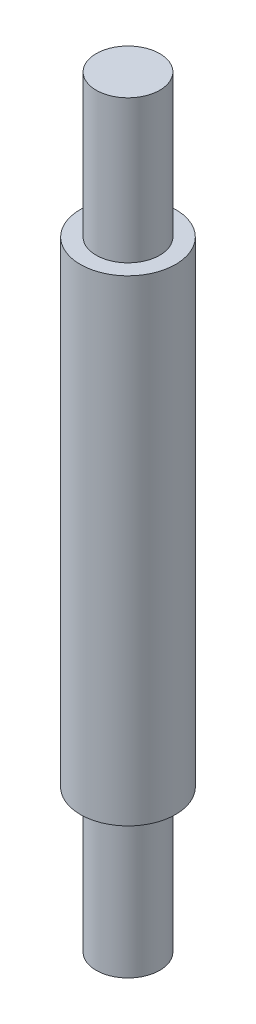
ISO-10303-21;
HEADER;
FILE_DESCRIPTION(('STEP AP214'),'2;1');
FILE_NAME('part.step','',(''),(''),'','','');
FILE_SCHEMA(('AUTOMOTIVE_DESIGN { 1 0 10303 214 1 1 1 1 }'));
ENDSEC;
DATA;
#1=APPLICATION_CONTEXT('core data for automotive mechanical design processes');
#2=APPLICATION_PROTOCOL_DEFINITION('international standard','automotive_design',2000,#1);
#3=PRODUCT_CONTEXT('',#1,'mechanical');
#4=PRODUCT('Part','Part','',(#3));
#5=PRODUCT_RELATED_PRODUCT_CATEGORY('part','',(#4));
#6=PRODUCT_DEFINITION_FORMATION('','',#4);
#7=PRODUCT_DEFINITION_CONTEXT('part definition',#1,'design');
#8=PRODUCT_DEFINITION('design','',#6,#7);
#9=PRODUCT_DEFINITION_SHAPE('','',#8);
#10=(LENGTH_UNIT() NAMED_UNIT(*) SI_UNIT(.MILLI.,.METRE.));
#11=(NAMED_UNIT(*) PLANE_ANGLE_UNIT() SI_UNIT($,.RADIAN.));
#12=(NAMED_UNIT(*) SI_UNIT($,.STERADIAN.) SOLID_ANGLE_UNIT());
#13=UNCERTAINTY_MEASURE_WITH_UNIT(LENGTH_MEASURE(1.E-05),#10,'distance_accuracy_value','');
#14=(GEOMETRIC_REPRESENTATION_CONTEXT(3) GLOBAL_UNCERTAINTY_ASSIGNED_CONTEXT((#13)) GLOBAL_UNIT_ASSIGNED_CONTEXT((#10,
#11,#12)) REPRESENTATION_CONTEXT('',''));
#15=CARTESIAN_POINT('',(0.,0.,0.));
#16=DIRECTION('',(0.,0.,1.));
#17=DIRECTION('',(1.,0.,0.));
#18=AXIS2_PLACEMENT_3D('',#15,#16,#17);
#19=CARTESIAN_POINT('',(0.,75.,0.));
#20=DIRECTION('',(0.,-1.,0.));
#21=DIRECTION('',(0.,0.,-1.));
#22=AXIS2_PLACEMENT_3D('',#19,#20,#21);
#23=CYLINDRICAL_SURFACE('',#22,15.);
#24=CARTESIAN_POINT('',(0.,75.,0.));
#25=DIRECTION('',(0.,1.,0.));
#26=DIRECTION('',(0.,0.,1.));
#27=AXIS2_PLACEMENT_3D('',#24,#25,#26);
#28=CIRCLE('',#27,15.);
#29=CARTESIAN_POINT('',(0.,75.,15.));
#30=VERTEX_POINT('',#29);
#31=EDGE_CURVE('E44',#30,#30,#28,.T.);
#32=ORIENTED_EDGE('',*,*,#31,.F.);
#33=EDGE_LOOP('',(#32));
#34=FACE_BOUND('',#33,.T.);
#35=CARTESIAN_POINT('',(0.,-75.,0.));
#36=DIRECTION('',(0.,1.,0.));
#37=DIRECTION('',(0.,0.,1.));
#38=AXIS2_PLACEMENT_3D('',#35,#36,#37);
#39=CIRCLE('',#38,15.);
#40=CARTESIAN_POINT('',(0.,-75.,15.));
#41=VERTEX_POINT('',#40);
#42=EDGE_CURVE('E40',#41,#41,#39,.T.);
#43=ORIENTED_EDGE('',*,*,#42,.T.);
#44=EDGE_LOOP('',(#43));
#45=FACE_BOUND('',#44,.T.);
#46=ADVANCED_FACE('F37',(#34,#45),#23,.T.);
#47=CARTESIAN_POINT('',(0.,75.,0.));
#48=DIRECTION('',(0.,1.,0.));
#49=DIRECTION('',(0.,0.,1.));
#50=AXIS2_PLACEMENT_3D('',#47,#48,#49);
#51=PLANE('',#50);
#52=CARTESIAN_POINT('',(0.,75.,0.));
#53=DIRECTION('',(0.,1.,0.));
#54=DIRECTION('',(0.,0.,1.));
#55=AXIS2_PLACEMENT_3D('',#52,#53,#54);
#56=CIRCLE('',#55,10.);
#57=CARTESIAN_POINT('',(0.,75.,-10.));
#58=VERTEX_POINT('',#57);
#59=EDGE_CURVE('E10',#58,#58,#56,.T.);
#60=ORIENTED_EDGE('',*,*,#59,.F.);
#61=EDGE_LOOP('',(#60));
#62=FACE_BOUND('',#61,.T.);
#63=ORIENTED_EDGE('',*,*,#31,.T.);
#64=EDGE_LOOP('',(#63));
#65=FACE_BOUND('',#64,.T.);
#66=ADVANCED_FACE('F72',(#62,#65),#51,.T.);
#67=CARTESIAN_POINT('',(0.,-75.,0.));
#68=DIRECTION('',(0.,1.,0.));
#69=DIRECTION('',(0.,0.,1.));
#70=AXIS2_PLACEMENT_3D('',#67,#68,#69);
#71=PLANE('',#70);
#72=CARTESIAN_POINT('',(0.,-75.,0.));
#73=DIRECTION('',(0.,1.,0.));
#74=DIRECTION('',(0.,0.,1.));
#75=AXIS2_PLACEMENT_3D('',#72,#73,#74);
#76=CIRCLE('',#75,10.);
#77=CARTESIAN_POINT('',(0.,-75.,10.));
#78=VERTEX_POINT('',#77);
#79=EDGE_CURVE('E54',#78,#78,#76,.T.);
#80=ORIENTED_EDGE('',*,*,#79,.T.);
#81=EDGE_LOOP('',(#80));
#82=FACE_BOUND('',#81,.T.);
#83=ORIENTED_EDGE('',*,*,#42,.F.);
#84=EDGE_LOOP('',(#83));
#85=FACE_BOUND('',#84,.T.);
#86=ADVANCED_FACE('F77',(#82,#85),#71,.F.);
#87=CARTESIAN_POINT('',(0.,120.,0.));
#88=DIRECTION('',(0.,-1.,0.));
#89=DIRECTION('',(0.,0.,-1.));
#90=AXIS2_PLACEMENT_3D('',#87,#88,#89);
#91=CYLINDRICAL_SURFACE('',#90,10.);
#92=CARTESIAN_POINT('',(0.,120.,0.));
#93=DIRECTION('',(0.,1.,0.));
#94=DIRECTION('',(0.,0.,1.));
#95=AXIS2_PLACEMENT_3D('',#92,#93,#94);
#96=CIRCLE('',#95,10.);
#97=CARTESIAN_POINT('',(0.,120.,-10.));
#98=VERTEX_POINT('',#97);
#99=EDGE_CURVE('E50',#98,#98,#96,.T.);
#100=CARTESIAN_POINT('',(0.,120.,-10.));
#101=CARTESIAN_POINT('',(0.,119.53125,-10.));
#102=CARTESIAN_POINT('',(0.,119.0625,-10.));
#103=CARTESIAN_POINT('',(0.,118.125,-10.));
#104=CARTESIAN_POINT('',(0.,117.65625,-10.));
#105=CARTESIAN_POINT('',(0.,116.71875,-10.));
#106=CARTESIAN_POINT('',(0.,116.25,-10.));
#107=CARTESIAN_POINT('',(0.,115.3125,-10.));
#108=CARTESIAN_POINT('',(0.,114.84375,-10.));
#109=CARTESIAN_POINT('',(0.,113.90625,-10.));
#110=CARTESIAN_POINT('',(0.,113.4375,-10.));
#111=CARTESIAN_POINT('',(0.,112.5,-10.));
#112=CARTESIAN_POINT('',(0.,112.03125,-10.));
#113=CARTESIAN_POINT('',(0.,111.09375,-10.));
#114=CARTESIAN_POINT('',(0.,110.625,-10.));
#115=CARTESIAN_POINT('',(0.,109.6875,-10.));
#116=CARTESIAN_POINT('',(0.,109.21875,-10.));
#117=CARTESIAN_POINT('',(0.,108.28125,-10.));
#118=CARTESIAN_POINT('',(0.,107.8125,-10.));
#119=CARTESIAN_POINT('',(0.,106.875,-10.));
#120=CARTESIAN_POINT('',(0.,106.40625,-10.));
#121=CARTESIAN_POINT('',(0.,105.46875,-10.));
#122=CARTESIAN_POINT('',(0.,105.,-10.));
#123=CARTESIAN_POINT('',(0.,104.0625,-10.));
#124=CARTESIAN_POINT('',(0.,103.59375,-10.));
#125=CARTESIAN_POINT('',(0.,102.65625,-10.));
#126=CARTESIAN_POINT('',(0.,102.1875,-10.));
#127=CARTESIAN_POINT('',(0.,101.25,-10.));
#128=CARTESIAN_POINT('',(0.,100.78125,-10.));
#129=CARTESIAN_POINT('',(0.,99.84375,-10.));
#130=CARTESIAN_POINT('',(0.,99.375,-10.));
#131=CARTESIAN_POINT('',(0.,98.4375,-10.));
#132=CARTESIAN_POINT('',(0.,97.96875,-10.));
#133=CARTESIAN_POINT('',(0.,97.03125,-10.));
#134=CARTESIAN_POINT('',(0.,96.5625,-10.));
#135=CARTESIAN_POINT('',(0.,95.625,-10.));
#136=CARTESIAN_POINT('',(0.,95.15625,-10.));
#137=CARTESIAN_POINT('',(0.,94.21875,-10.));
#138=CARTESIAN_POINT('',(0.,93.75,-10.));
#139=CARTESIAN_POINT('',(0.,92.8125,-10.));
#140=CARTESIAN_POINT('',(0.,92.34375,-10.));
#141=CARTESIAN_POINT('',(0.,91.40625,-10.));
#142=CARTESIAN_POINT('',(0.,90.9375,-10.));
#143=CARTESIAN_POINT('',(0.,90.,-10.));
#144=CARTESIAN_POINT('',(0.,89.53125,-10.));
#145=CARTESIAN_POINT('',(0.,88.59375,-10.));
#146=CARTESIAN_POINT('',(0.,88.125,-10.));
#147=CARTESIAN_POINT('',(0.,87.1875,-10.));
#148=CARTESIAN_POINT('',(0.,86.71875,-10.));
#149=CARTESIAN_POINT('',(0.,85.78125,-10.));
#150=CARTESIAN_POINT('',(0.,85.3125,-10.));
#151=CARTESIAN_POINT('',(0.,84.375,-10.));
#152=CARTESIAN_POINT('',(0.,83.90625,-10.));
#153=CARTESIAN_POINT('',(0.,82.96875,-10.));
#154=CARTESIAN_POINT('',(0.,82.5,-10.));
#155=CARTESIAN_POINT('',(0.,81.5625,-10.));
#156=CARTESIAN_POINT('',(0.,81.09375,-10.));
#157=CARTESIAN_POINT('',(0.,80.15625,-10.));
#158=CARTESIAN_POINT('',(0.,79.6875,-10.));
#159=CARTESIAN_POINT('',(0.,78.75,-10.));
#160=CARTESIAN_POINT('',(0.,78.28125,-10.));
#161=CARTESIAN_POINT('',(0.,77.34375,-10.));
#162=CARTESIAN_POINT('',(0.,76.875,-10.));
#163=CARTESIAN_POINT('',(0.,75.9375,-10.));
#164=CARTESIAN_POINT('',(0.,75.46875,-10.));
#165=CARTESIAN_POINT('',(0.,75.,-10.));
#166=B_SPLINE_CURVE_WITH_KNOTS('',3,(#100,#101,#102,#103,#104,#105,#106,#107,#108,#109,#110,
#111,#112,#113,#114,#115,#116,#117,#118,#119,#120,#121,#122,#123,#124,#125,#126,#127,#128,#129,
#130,#131,#132,#133,#134,#135,#136,#137,#138,#139,#140,#141,#142,#143,#144,#145,#146,#147,#148,
#149,#150,#151,#152,#153,#154,#155,#156,#157,#158,#159,#160,#161,#162,#163,#164,#165),
.UNSPECIFIED.,.F.,.F.,(4,2,2,2,2,2,2,2,2,2,2,2,2,2,2,2,2,2,2,2,2,2,2,2,2,2,2,2,2,2,2,2,4),(0.,
1.40625000000001,2.81250000000001,4.21875000000001,5.62500000000001,7.03125,8.4375,
9.84375000000001,11.25,12.65625,14.0625,15.46875,16.875,18.28125,19.6875,21.09375,22.5,23.90625,
25.3125,26.71875,28.125,29.53125,30.9375,32.34375,33.75,35.15625,36.5625,37.96875,39.375,
40.78125,42.1875,43.59375,45.),.UNSPECIFIED.);
#167=EDGE_CURVE('BSEAM86',#98,#58,#166,.T.);
#168=ORIENTED_EDGE('',*,*,#99,.F.);
#169=ORIENTED_EDGE('',*,*,#59,.T.);
#170=ORIENTED_EDGE('',*,*,#167,.T.);
#171=ORIENTED_EDGE('',*,*,#167,.F.);
#172=EDGE_LOOP('',(#168,#170,#169,#171));
#173=FACE_BOUND('',#172,.T.);
#174=ADVANCED_FACE('F86',(#173),#91,.T.);
#175=CARTESIAN_POINT('',(0.,120.,0.));
#176=DIRECTION('',(0.,1.,0.));
#177=DIRECTION('',(0.,0.,1.));
#178=AXIS2_PLACEMENT_3D('',#175,#176,#177);
#179=PLANE('',#178);
#180=ORIENTED_EDGE('',*,*,#99,.T.);
#181=EDGE_LOOP('',(#180));
#182=FACE_BOUND('',#181,.T.);
#183=ADVANCED_FACE('F69',(#182),#179,.T.);
#184=CARTESIAN_POINT('',(0.,-120.,0.));
#185=DIRECTION('',(0.,1.,0.));
#186=DIRECTION('',(0.,0.,1.));
#187=AXIS2_PLACEMENT_3D('',#184,#185,#186);
#188=CYLINDRICAL_SURFACE('',#187,10.);
#189=CARTESIAN_POINT('',(0.,-120.,0.));
#190=DIRECTION('',(0.,1.,0.));
#191=DIRECTION('',(0.,0.,1.));
#192=AXIS2_PLACEMENT_3D('',#189,#190,#191);
#193=CIRCLE('',#192,10.);
#194=CARTESIAN_POINT('',(0.,-120.,10.));
#195=VERTEX_POINT('',#194);
#196=EDGE_CURVE('E53',#195,#195,#193,.T.);
#197=CARTESIAN_POINT('',(0.,-120.,10.));
#198=CARTESIAN_POINT('',(0.,-119.53125,10.));
#199=CARTESIAN_POINT('',(0.,-119.0625,10.));
#200=CARTESIAN_POINT('',(0.,-118.125,10.));
#201=CARTESIAN_POINT('',(0.,-117.65625,10.));
#202=CARTESIAN_POINT('',(0.,-116.71875,10.));
#203=CARTESIAN_POINT('',(0.,-116.25,10.));
#204=CARTESIAN_POINT('',(0.,-115.3125,10.));
#205=CARTESIAN_POINT('',(0.,-114.84375,10.));
#206=CARTESIAN_POINT('',(0.,-113.90625,10.));
#207=CARTESIAN_POINT('',(0.,-113.4375,10.));
#208=CARTESIAN_POINT('',(0.,-112.5,10.));
#209=CARTESIAN_POINT('',(0.,-112.03125,10.));
#210=CARTESIAN_POINT('',(0.,-111.09375,10.));
#211=CARTESIAN_POINT('',(0.,-110.625,10.));
#212=CARTESIAN_POINT('',(0.,-109.6875,10.));
#213=CARTESIAN_POINT('',(0.,-109.21875,10.));
#214=CARTESIAN_POINT('',(0.,-108.28125,10.));
#215=CARTESIAN_POINT('',(0.,-107.8125,10.));
#216=CARTESIAN_POINT('',(0.,-106.875,10.));
#217=CARTESIAN_POINT('',(0.,-106.40625,10.));
#218=CARTESIAN_POINT('',(0.,-105.46875,10.));
#219=CARTESIAN_POINT('',(0.,-105.,10.));
#220=CARTESIAN_POINT('',(0.,-104.0625,10.));
#221=CARTESIAN_POINT('',(0.,-103.59375,10.));
#222=CARTESIAN_POINT('',(0.,-102.65625,10.));
#223=CARTESIAN_POINT('',(0.,-102.1875,10.));
#224=CARTESIAN_POINT('',(0.,-101.25,10.));
#225=CARTESIAN_POINT('',(0.,-100.78125,10.));
#226=CARTESIAN_POINT('',(0.,-99.84375,10.));
#227=CARTESIAN_POINT('',(0.,-99.375,10.));
#228=CARTESIAN_POINT('',(0.,-98.4375,10.));
#229=CARTESIAN_POINT('',(0.,-97.96875,10.));
#230=CARTESIAN_POINT('',(0.,-97.03125,10.));
#231=CARTESIAN_POINT('',(0.,-96.5625,10.));
#232=CARTESIAN_POINT('',(0.,-95.625,10.));
#233=CARTESIAN_POINT('',(0.,-95.15625,10.));
#234=CARTESIAN_POINT('',(0.,-94.21875,10.));
#235=CARTESIAN_POINT('',(0.,-93.75,10.));
#236=CARTESIAN_POINT('',(0.,-92.8125,10.));
#237=CARTESIAN_POINT('',(0.,-92.34375,10.));
#238=CARTESIAN_POINT('',(0.,-91.40625,10.));
#239=CARTESIAN_POINT('',(0.,-90.9375,10.));
#240=CARTESIAN_POINT('',(0.,-90.,10.));
#241=CARTESIAN_POINT('',(0.,-89.53125,10.));
#242=CARTESIAN_POINT('',(0.,-88.59375,10.));
#243=CARTESIAN_POINT('',(0.,-88.125,10.));
#244=CARTESIAN_POINT('',(0.,-87.1875,10.));
#245=CARTESIAN_POINT('',(0.,-86.71875,10.));
#246=CARTESIAN_POINT('',(0.,-85.78125,10.));
#247=CARTESIAN_POINT('',(0.,-85.3125,10.));
#248=CARTESIAN_POINT('',(0.,-84.375,10.));
#249=CARTESIAN_POINT('',(0.,-83.90625,10.));
#250=CARTESIAN_POINT('',(0.,-82.96875,10.));
#251=CARTESIAN_POINT('',(0.,-82.5,10.));
#252=CARTESIAN_POINT('',(0.,-81.5625,10.));
#253=CARTESIAN_POINT('',(0.,-81.09375,10.));
#254=CARTESIAN_POINT('',(0.,-80.15625,10.));
#255=CARTESIAN_POINT('',(0.,-79.6875,10.));
#256=CARTESIAN_POINT('',(0.,-78.75,10.));
#257=CARTESIAN_POINT('',(0.,-78.28125,10.));
#258=CARTESIAN_POINT('',(0.,-77.34375,10.));
#259=CARTESIAN_POINT('',(0.,-76.875,10.));
#260=CARTESIAN_POINT('',(0.,-75.9375,10.));
#261=CARTESIAN_POINT('',(0.,-75.46875,10.));
#262=CARTESIAN_POINT('',(0.,-75.,10.));
#263=B_SPLINE_CURVE_WITH_KNOTS('',3,(#197,#198,#199,#200,#201,#202,#203,#204,#205,#206,#207,
#208,#209,#210,#211,#212,#213,#214,#215,#216,#217,#218,#219,#220,#221,#222,#223,#224,#225,#226,
#227,#228,#229,#230,#231,#232,#233,#234,#235,#236,#237,#238,#239,#240,#241,#242,#243,#244,#245,
#246,#247,#248,#249,#250,#251,#252,#253,#254,#255,#256,#257,#258,#259,#260,#261,#262),
.UNSPECIFIED.,.F.,.F.,(4,2,2,2,2,2,2,2,2,2,2,2,2,2,2,2,2,2,2,2,2,2,2,2,2,2,2,2,2,2,2,2,4),(0.,
1.40625000000001,2.81250000000001,4.21875000000001,5.62500000000001,7.03125,8.4375,
9.84375000000001,11.25,12.65625,14.0625,15.46875,16.875,18.28125,19.6875,21.09375,22.5,23.90625,
25.3125,26.71875,28.125,29.53125,30.9375,32.34375,33.75,35.15625,36.5625,37.96875,39.375,
40.78125,42.1875,43.59375,45.),.UNSPECIFIED.);
#264=EDGE_CURVE('BSEAM60',#195,#78,#263,.T.);
#265=ORIENTED_EDGE('',*,*,#196,.T.);
#266=ORIENTED_EDGE('',*,*,#79,.F.);
#267=ORIENTED_EDGE('',*,*,#264,.T.);
#268=ORIENTED_EDGE('',*,*,#264,.F.);
#269=EDGE_LOOP('',(#265,#267,#266,#268));
#270=FACE_BOUND('',#269,.T.);
#271=ADVANCED_FACE('F60',(#270),#188,.T.);
#272=CARTESIAN_POINT('',(0.,-120.,0.));
#273=DIRECTION('',(0.,-1.,0.));
#274=DIRECTION('',(0.,0.,1.));
#275=AXIS2_PLACEMENT_3D('',#272,#273,#274);
#276=PLANE('',#275);
#277=ORIENTED_EDGE('',*,*,#196,.F.);
#278=EDGE_LOOP('',(#277));
#279=FACE_BOUND('',#278,.T.);
#280=ADVANCED_FACE('F63',(#279),#276,.T.);
#281=CLOSED_SHELL('',(#46,#66,#86,#174,#183,#271,#280));
#282=MANIFOLD_SOLID_BREP('B2',#281);
#283=ADVANCED_BREP_SHAPE_REPRESENTATION('',(#18,#282),#14);
#284=SHAPE_DEFINITION_REPRESENTATION(#9,#283);
ENDSEC;
END-ISO-10303-21;
